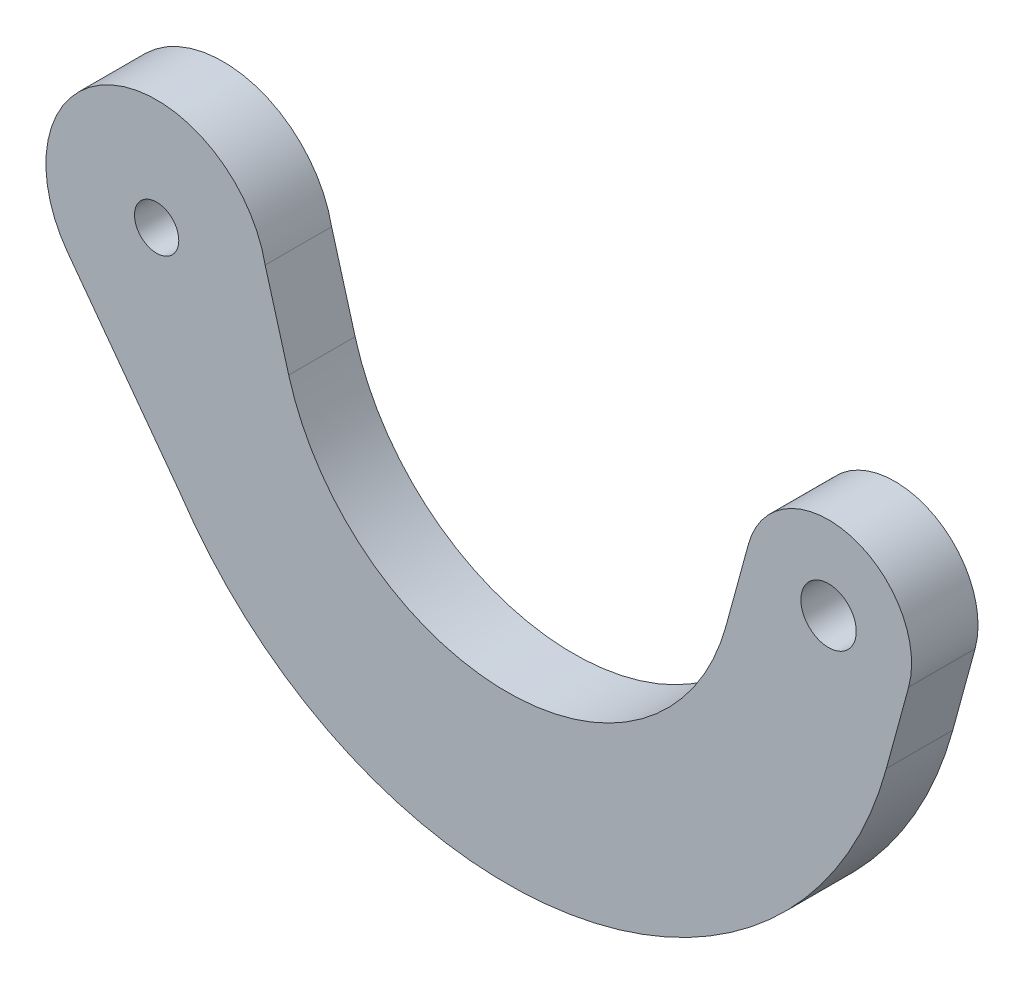
ISO-10303-21;
HEADER;
FILE_DESCRIPTION(('STEP AP214'),'2;1');
FILE_NAME('part.step','',(''),(''),'','','');
FILE_SCHEMA(('AUTOMOTIVE_DESIGN { 1 0 10303 214 1 1 1 1 }'));
ENDSEC;
DATA;
#1=APPLICATION_CONTEXT('core data for automotive mechanical design processes');
#2=APPLICATION_PROTOCOL_DEFINITION('international standard','automotive_design',2000,#1);
#3=PRODUCT_CONTEXT('',#1,'mechanical');
#4=PRODUCT('Part','Part','',(#3));
#5=PRODUCT_RELATED_PRODUCT_CATEGORY('part','',(#4));
#6=PRODUCT_DEFINITION_FORMATION('','',#4);
#7=PRODUCT_DEFINITION_CONTEXT('part definition',#1,'design');
#8=PRODUCT_DEFINITION('design','',#6,#7);
#9=PRODUCT_DEFINITION_SHAPE('','',#8);
#10=(LENGTH_UNIT() NAMED_UNIT(*) SI_UNIT(.MILLI.,.METRE.));
#11=(NAMED_UNIT(*) PLANE_ANGLE_UNIT() SI_UNIT($,.RADIAN.));
#12=(NAMED_UNIT(*) SI_UNIT($,.STERADIAN.) SOLID_ANGLE_UNIT());
#13=UNCERTAINTY_MEASURE_WITH_UNIT(LENGTH_MEASURE(1.E-05),#10,'distance_accuracy_value','');
#14=(GEOMETRIC_REPRESENTATION_CONTEXT(3) GLOBAL_UNCERTAINTY_ASSIGNED_CONTEXT((#13)) GLOBAL_UNIT_ASSIGNED_CONTEXT((#10,
#11,#12)) REPRESENTATION_CONTEXT('',''));
#15=CARTESIAN_POINT('',(0.,0.,0.));
#16=DIRECTION('',(0.,0.,1.));
#17=DIRECTION('',(1.,0.,0.));
#18=AXIS2_PLACEMENT_3D('',#15,#16,#17);
#19=CARTESIAN_POINT('',(60.683,0.,6.));
#20=DIRECTION('',(0.,0.,1.));
#21=DIRECTION('',(1.,0.,0.));
#22=AXIS2_PLACEMENT_3D('',#19,#20,#21);
#23=PLANE('',#22);
#24=CARTESIAN_POINT('',(0.,0.,6.));
#25=DIRECTION('',(0.,0.,1.));
#26=DIRECTION('',(1.,0.,0.));
#27=AXIS2_PLACEMENT_3D('',#24,#25,#26);
#28=CIRCLE('',#27,2.);
#29=CARTESIAN_POINT('',(2.,0.,6.));
#30=VERTEX_POINT('',#29);
#31=EDGE_CURVE('E134',#30,#30,#28,.T.);
#32=ORIENTED_EDGE('',*,*,#31,.F.);
#33=EDGE_LOOP('',(#32));
#34=FACE_BOUND('',#33,.T.);
#35=CARTESIAN_POINT('',(60.683,0.,6.));
#36=DIRECTION('',(0.,0.,1.));
#37=DIRECTION('',(1.,0.,0.));
#38=AXIS2_PLACEMENT_3D('',#35,#36,#37);
#39=CIRCLE('',#38,7.50000000000001);
#40=CARTESIAN_POINT('',(67.9183156248185,-1.97489437926602,6.));
#41=VERTEX_POINT('',#40);
#42=CARTESIAN_POINT('',(53.4476843751814,1.97489437926603,6.));
#43=VERTEX_POINT('',#42);
#44=EDGE_CURVE('E145',#41,#43,#39,.T.);
#45=ORIENTED_EDGE('',*,*,#44,.T.);
#46=DIRECTION('',(-0.263319250568803,-0.964708749975807,0.));
#47=VECTOR('',#46,1.);
#48=CARTESIAN_POINT('',(53.4476843751814,1.97489437926603,6.));
#49=LINE('',#48,#47);
#50=CARTESIAN_POINT('',(51.435225406387,-5.39804463666048,6.));
#51=VERTEX_POINT('',#50);
#52=EDGE_CURVE('E93',#43,#51,#49,.T.);
#53=ORIENTED_EDGE('',*,*,#52,.T.);
#54=CARTESIAN_POINT('',(31.658696031883,0.,6.));
#55=DIRECTION('',(0.,0.,-1.));
#56=DIRECTION('',(1.,0.,0.));
#57=AXIS2_PLACEMENT_3D('',#54,#55,#56);
#58=CIRCLE('',#57,20.5);
#59=CARTESIAN_POINT('',(11.9276637306332,-5.56204677497749,6.));
#60=VERTEX_POINT('',#59);
#61=EDGE_CURVE('E160',#51,#60,#58,.T.);
#62=ORIENTED_EDGE('',*,*,#61,.T.);
#63=DIRECTION('',(-0.271319354876951,0.96248938054877,0.));
#64=VECTOR('',#63,1.);
#65=CARTESIAN_POINT('',(9.80305014731351,1.97489437926603,6.));
#66=LINE('',#65,#64);
#67=CARTESIAN_POINT('',(9.80305014731351,1.97489437926603,6.));
#68=VERTEX_POINT('',#67);
#69=EDGE_CURVE('E173',#60,#68,#66,.T.);
#70=ORIENTED_EDGE('',*,*,#69,.T.);
#71=CARTESIAN_POINT('',(0.,0.,6.));
#72=DIRECTION('',(0.,0.,1.));
#73=DIRECTION('',(1.,0.,0.));
#74=AXIS2_PLACEMENT_3D('',#71,#72,#73);
#75=CIRCLE('',#74,10.);
#76=CARTESIAN_POINT('',(-8.04113037462213,-5.9447642760945,6.));
#77=VERTEX_POINT('',#76);
#78=EDGE_CURVE('E112',#68,#77,#75,.T.);
#79=ORIENTED_EDGE('',*,*,#78,.T.);
#80=DIRECTION('',(0.594476427609448,-0.804113037462214,0.));
#81=VECTOR('',#80,1.);
#82=CARTESIAN_POINT('',(-8.04113037462213,-5.9447642760945,6.));
#83=LINE('',#82,#81);
#84=CARTESIAN_POINT('',(2.11077506429604,-19.6766452042323,6.));
#85=VERTEX_POINT('',#84);
#86=EDGE_CURVE('E106',#77,#85,#83,.T.);
#87=ORIENTED_EDGE('',*,*,#86,.T.);
#88=CARTESIAN_POINT('',(31.658696031883,0.,6.));
#89=DIRECTION('',(0.,0.,1.));
#90=DIRECTION('',(1.,0.,0.));
#91=AXIS2_PLACEMENT_3D('',#88,#89,#90);
#92=CIRCLE('',#91,35.5);
#93=CARTESIAN_POINT('',(65.9058566560241,-9.3478333951925,6.));
#94=VERTEX_POINT('',#93);
#95=EDGE_CURVE('E110',#85,#94,#92,.T.);
#96=ORIENTED_EDGE('',*,*,#95,.T.);
#97=DIRECTION('',(0.263319250568805,0.964708749975806,0.));
#98=VECTOR('',#97,1.);
#99=CARTESIAN_POINT('',(67.9183156248185,-1.97489437926602,6.));
#100=LINE('',#99,#98);
#101=EDGE_CURVE('E50',#94,#41,#100,.T.);
#102=ORIENTED_EDGE('',*,*,#101,.T.);
#103=EDGE_LOOP('',(#45,#53,#62,#70,#79,#87,#96,#102));
#104=FACE_BOUND('',#103,.T.);
#105=CARTESIAN_POINT('',(60.683,0.,6.));
#106=DIRECTION('',(0.,0.,1.));
#107=DIRECTION('',(1.,0.,0.));
#108=AXIS2_PLACEMENT_3D('',#105,#106,#107);
#109=CIRCLE('',#108,2.50000000000001);
#110=CARTESIAN_POINT('',(63.183,0.,6.));
#111=VERTEX_POINT('',#110);
#112=EDGE_CURVE('E182',#111,#111,#109,.T.);
#113=ORIENTED_EDGE('',*,*,#112,.F.);
#114=EDGE_LOOP('',(#113));
#115=FACE_BOUND('',#114,.T.);
#116=ADVANCED_FACE('F33',(#34,#104,#115),#23,.T.);
#117=CARTESIAN_POINT('',(60.683,0.,0.));
#118=DIRECTION('',(0.,0.,1.));
#119=DIRECTION('',(1.,0.,0.));
#120=AXIS2_PLACEMENT_3D('',#117,#118,#119);
#121=PLANE('',#120);
#122=CARTESIAN_POINT('',(0.,0.,0.));
#123=DIRECTION('',(0.,0.,1.));
#124=DIRECTION('',(1.,0.,0.));
#125=AXIS2_PLACEMENT_3D('',#122,#123,#124);
#126=CIRCLE('',#125,2.);
#127=CARTESIAN_POINT('',(2.,0.,0.));
#128=VERTEX_POINT('',#127);
#129=EDGE_CURVE('E179',#128,#128,#126,.T.);
#130=ORIENTED_EDGE('',*,*,#129,.T.);
#131=EDGE_LOOP('',(#130));
#132=FACE_BOUND('',#131,.T.);
#133=CARTESIAN_POINT('',(60.683,0.,0.));
#134=DIRECTION('',(0.,0.,1.));
#135=DIRECTION('',(1.,0.,0.));
#136=AXIS2_PLACEMENT_3D('',#133,#134,#135);
#137=CIRCLE('',#136,7.50000000000001);
#138=CARTESIAN_POINT('',(67.9183156248185,-1.97489437926602,0.));
#139=VERTEX_POINT('',#138);
#140=CARTESIAN_POINT('',(53.4476843751814,1.97489437926603,0.));
#141=VERTEX_POINT('',#140);
#142=EDGE_CURVE('E130',#139,#141,#137,.T.);
#143=ORIENTED_EDGE('',*,*,#142,.F.);
#144=DIRECTION('',(0.263319250568805,0.964708749975806,0.));
#145=VECTOR('',#144,1.);
#146=CARTESIAN_POINT('',(67.9183156248185,-1.97489437926602,0.));
#147=LINE('',#146,#145);
#148=CARTESIAN_POINT('',(65.9058566560241,-9.3478333951925,0.));
#149=VERTEX_POINT('',#148);
#150=EDGE_CURVE('E85',#149,#139,#147,.T.);
#151=ORIENTED_EDGE('',*,*,#150,.F.);
#152=CARTESIAN_POINT('',(31.658696031883,0.,0.));
#153=DIRECTION('',(0.,0.,1.));
#154=DIRECTION('',(1.,0.,0.));
#155=AXIS2_PLACEMENT_3D('',#152,#153,#154);
#156=CIRCLE('',#155,35.5);
#157=CARTESIAN_POINT('',(2.11077506429604,-19.6766452042323,0.));
#158=VERTEX_POINT('',#157);
#159=EDGE_CURVE('E79',#158,#149,#156,.T.);
#160=ORIENTED_EDGE('',*,*,#159,.F.);
#161=DIRECTION('',(0.594476427609448,-0.804113037462214,0.));
#162=VECTOR('',#161,1.);
#163=CARTESIAN_POINT('',(-8.04113037462213,-5.9447642760945,0.));
#164=LINE('',#163,#162);
#165=CARTESIAN_POINT('',(-8.04113037462213,-5.9447642760945,0.));
#166=VERTEX_POINT('',#165);
#167=EDGE_CURVE('E120',#166,#158,#164,.T.);
#168=ORIENTED_EDGE('',*,*,#167,.F.);
#169=CARTESIAN_POINT('',(0.,0.,0.));
#170=DIRECTION('',(0.,0.,1.));
#171=DIRECTION('',(1.,0.,0.));
#172=AXIS2_PLACEMENT_3D('',#169,#170,#171);
#173=CIRCLE('',#172,10.);
#174=CARTESIAN_POINT('',(9.80305014731351,1.97489437926603,0.));
#175=VERTEX_POINT('',#174);
#176=EDGE_CURVE('E140',#175,#166,#173,.T.);
#177=ORIENTED_EDGE('',*,*,#176,.F.);
#178=DIRECTION('',(-0.271319354876951,0.96248938054877,0.));
#179=VECTOR('',#178,1.);
#180=CARTESIAN_POINT('',(9.80305014731351,1.97489437926603,0.));
#181=LINE('',#180,#179);
#182=CARTESIAN_POINT('',(11.9276637306332,-5.56204677497749,0.));
#183=VERTEX_POINT('',#182);
#184=EDGE_CURVE('E138',#183,#175,#181,.T.);
#185=ORIENTED_EDGE('',*,*,#184,.F.);
#186=CARTESIAN_POINT('',(31.658696031883,0.,0.));
#187=DIRECTION('',(0.,0.,-1.));
#188=DIRECTION('',(1.,0.,0.));
#189=AXIS2_PLACEMENT_3D('',#186,#187,#188);
#190=CIRCLE('',#189,20.5);
#191=CARTESIAN_POINT('',(51.435225406387,-5.39804463666048,0.));
#192=VERTEX_POINT('',#191);
#193=EDGE_CURVE('E136',#192,#183,#190,.T.);
#194=ORIENTED_EDGE('',*,*,#193,.F.);
#195=DIRECTION('',(-0.263319250568803,-0.964708749975807,0.));
#196=VECTOR('',#195,1.);
#197=CARTESIAN_POINT('',(53.4476843751814,1.97489437926603,0.));
#198=LINE('',#197,#196);
#199=EDGE_CURVE('E133',#141,#192,#198,.T.);
#200=ORIENTED_EDGE('',*,*,#199,.F.);
#201=EDGE_LOOP('',(#143,#151,#160,#168,#177,#185,#194,#200));
#202=FACE_BOUND('',#201,.T.);
#203=CARTESIAN_POINT('',(60.683,0.,0.));
#204=DIRECTION('',(0.,0.,1.));
#205=DIRECTION('',(1.,0.,0.));
#206=AXIS2_PLACEMENT_3D('',#203,#204,#205);
#207=CIRCLE('',#206,2.50000000000001);
#208=CARTESIAN_POINT('',(63.183,0.,0.));
#209=VERTEX_POINT('',#208);
#210=EDGE_CURVE('E185',#209,#209,#207,.T.);
#211=ORIENTED_EDGE('',*,*,#210,.T.);
#212=EDGE_LOOP('',(#211));
#213=FACE_BOUND('',#212,.T.);
#214=ADVANCED_FACE('F164',(#132,#202,#213),#121,.F.);
#215=CARTESIAN_POINT('',(60.683,0.,6.));
#216=DIRECTION('',(0.,0.,-1.));
#217=DIRECTION('',(-1.,0.,0.));
#218=AXIS2_PLACEMENT_3D('',#215,#216,#217);
#219=CYLINDRICAL_SURFACE('',#218,7.50000000000001);
#220=ORIENTED_EDGE('',*,*,#142,.T.);
#221=DIRECTION('',(0.,0.,-1.));
#222=VECTOR('',#221,1.);
#223=CARTESIAN_POINT('',(53.4476843751814,1.97489437926603,6.));
#224=LINE('',#223,#222);
#225=EDGE_CURVE('E11',#43,#141,#224,.T.);
#226=ORIENTED_EDGE('',*,*,#225,.F.);
#227=ORIENTED_EDGE('',*,*,#44,.F.);
#228=DIRECTION('',(0.,0.,-1.));
#229=VECTOR('',#228,1.);
#230=CARTESIAN_POINT('',(67.9183156248185,-1.97489437926602,6.));
#231=LINE('',#230,#229);
#232=EDGE_CURVE('E126',#41,#139,#231,.T.);
#233=ORIENTED_EDGE('',*,*,#232,.T.);
#234=EDGE_LOOP('',(#220,#226,#227,#233));
#235=FACE_BOUND('',#234,.T.);
#236=ADVANCED_FACE('F35',(#235),#219,.T.);
#237=CARTESIAN_POINT('',(53.4476843751814,1.97489437926603,6.));
#238=DIRECTION('',(0.964708749975807,-0.263319250568803,0.));
#239=DIRECTION('',(0.263319250568803,0.964708749975807,0.));
#240=AXIS2_PLACEMENT_3D('',#237,#238,#239);
#241=PLANE('',#240);
#242=ORIENTED_EDGE('',*,*,#199,.T.);
#243=DIRECTION('',(0.,0.,-1.));
#244=VECTOR('',#243,1.);
#245=CARTESIAN_POINT('',(51.435225406387,-5.39804463666048,6.));
#246=LINE('',#245,#244);
#247=EDGE_CURVE('E42',#51,#192,#246,.T.);
#248=ORIENTED_EDGE('',*,*,#247,.F.);
#249=ORIENTED_EDGE('',*,*,#52,.F.);
#250=ORIENTED_EDGE('',*,*,#225,.T.);
#251=EDGE_LOOP('',(#242,#248,#249,#250));
#252=FACE_BOUND('',#251,.T.);
#253=ADVANCED_FACE('F218',(#252),#241,.F.);
#254=CARTESIAN_POINT('',(31.658696031883,0.,6.));
#255=DIRECTION('',(0.,0.,-1.));
#256=DIRECTION('',(-1.,0.,0.));
#257=AXIS2_PLACEMENT_3D('',#254,#255,#256);
#258=CYLINDRICAL_SURFACE('',#257,20.5);
#259=ORIENTED_EDGE('',*,*,#193,.T.);
#260=DIRECTION('',(0.,0.,-1.));
#261=VECTOR('',#260,1.);
#262=CARTESIAN_POINT('',(11.9276637306332,-5.56204677497749,6.));
#263=LINE('',#262,#261);
#264=EDGE_CURVE('E152',#60,#183,#263,.T.);
#265=ORIENTED_EDGE('',*,*,#264,.F.);
#266=ORIENTED_EDGE('',*,*,#61,.F.);
#267=ORIENTED_EDGE('',*,*,#247,.T.);
#268=EDGE_LOOP('',(#259,#265,#266,#267));
#269=FACE_BOUND('',#268,.T.);
#270=ADVANCED_FACE('F158',(#269),#258,.F.);
#271=CARTESIAN_POINT('',(9.80305014731351,1.97489437926603,6.));
#272=DIRECTION('',(-0.96248938054877,-0.271319354876951,0.));
#273=DIRECTION('',(0.271319354876951,-0.96248938054877,0.));
#274=AXIS2_PLACEMENT_3D('',#271,#272,#273);
#275=PLANE('',#274);
#276=ORIENTED_EDGE('',*,*,#184,.T.);
#277=DIRECTION('',(0.,0.,-1.));
#278=VECTOR('',#277,1.);
#279=CARTESIAN_POINT('',(9.80305014731351,1.97489437926603,6.));
#280=LINE('',#279,#278);
#281=EDGE_CURVE('E149',#68,#175,#280,.T.);
#282=ORIENTED_EDGE('',*,*,#281,.F.);
#283=ORIENTED_EDGE('',*,*,#69,.F.);
#284=ORIENTED_EDGE('',*,*,#264,.T.);
#285=EDGE_LOOP('',(#276,#282,#283,#284));
#286=FACE_BOUND('',#285,.T.);
#287=ADVANCED_FACE('F169',(#286),#275,.F.);
#288=CARTESIAN_POINT('',(0.,0.,6.));
#289=DIRECTION('',(0.,0.,-1.));
#290=DIRECTION('',(-1.,0.,0.));
#291=AXIS2_PLACEMENT_3D('',#288,#289,#290);
#292=CYLINDRICAL_SURFACE('',#291,10.);
#293=ORIENTED_EDGE('',*,*,#176,.T.);
#294=DIRECTION('',(0.,0.,-1.));
#295=VECTOR('',#294,1.);
#296=CARTESIAN_POINT('',(-8.04113037462213,-5.9447642760945,6.));
#297=LINE('',#296,#295);
#298=EDGE_CURVE('E121',#77,#166,#297,.T.);
#299=ORIENTED_EDGE('',*,*,#298,.F.);
#300=ORIENTED_EDGE('',*,*,#78,.F.);
#301=ORIENTED_EDGE('',*,*,#281,.T.);
#302=EDGE_LOOP('',(#293,#299,#300,#301));
#303=FACE_BOUND('',#302,.T.);
#304=ADVANCED_FACE('F172',(#303),#292,.T.);
#305=CARTESIAN_POINT('',(-8.04113037462213,-5.9447642760945,6.));
#306=DIRECTION('',(0.804113037462214,0.594476427609448,0.));
#307=DIRECTION('',(-0.594476427609449,0.804113037462214,0.));
#308=AXIS2_PLACEMENT_3D('',#305,#306,#307);
#309=PLANE('',#308);
#310=ORIENTED_EDGE('',*,*,#167,.T.);
#311=DIRECTION('',(0.,0.,-1.));
#312=VECTOR('',#311,1.);
#313=CARTESIAN_POINT('',(2.11077506429604,-19.6766452042323,6.));
#314=LINE('',#313,#312);
#315=EDGE_CURVE('E117',#85,#158,#314,.T.);
#316=ORIENTED_EDGE('',*,*,#315,.F.);
#317=ORIENTED_EDGE('',*,*,#86,.F.);
#318=ORIENTED_EDGE('',*,*,#298,.T.);
#319=EDGE_LOOP('',(#310,#316,#317,#318));
#320=FACE_BOUND('',#319,.T.);
#321=ADVANCED_FACE('F118',(#320),#309,.F.);
#322=CARTESIAN_POINT('',(31.658696031883,0.,6.));
#323=DIRECTION('',(0.,0.,-1.));
#324=DIRECTION('',(-1.,0.,0.));
#325=AXIS2_PLACEMENT_3D('',#322,#323,#324);
#326=CYLINDRICAL_SURFACE('',#325,35.5);
#327=ORIENTED_EDGE('',*,*,#159,.T.);
#328=DIRECTION('',(0.,0.,-1.));
#329=VECTOR('',#328,1.);
#330=CARTESIAN_POINT('',(65.9058566560241,-9.3478333951925,6.));
#331=LINE('',#330,#329);
#332=EDGE_CURVE('E122',#94,#149,#331,.T.);
#333=ORIENTED_EDGE('',*,*,#332,.F.);
#334=ORIENTED_EDGE('',*,*,#95,.F.);
#335=ORIENTED_EDGE('',*,*,#315,.T.);
#336=EDGE_LOOP('',(#327,#333,#334,#335));
#337=FACE_BOUND('',#336,.T.);
#338=ADVANCED_FACE('F124',(#337),#326,.T.);
#339=CARTESIAN_POINT('',(67.9183156248185,-1.97489437926602,6.));
#340=DIRECTION('',(-0.964708749975806,0.263319250568805,0.));
#341=DIRECTION('',(-0.263319250568805,-0.964708749975806,0.));
#342=AXIS2_PLACEMENT_3D('',#339,#340,#341);
#343=PLANE('',#342);
#344=ORIENTED_EDGE('',*,*,#150,.T.);
#345=ORIENTED_EDGE('',*,*,#232,.F.);
#346=ORIENTED_EDGE('',*,*,#101,.F.);
#347=ORIENTED_EDGE('',*,*,#332,.T.);
#348=EDGE_LOOP('',(#344,#345,#346,#347));
#349=FACE_BOUND('',#348,.T.);
#350=ADVANCED_FACE('F206',(#349),#343,.F.);
#351=CARTESIAN_POINT('',(0.,0.,6.));
#352=DIRECTION('',(0.,0.,-1.));
#353=DIRECTION('',(-1.,0.,0.));
#354=AXIS2_PLACEMENT_3D('',#351,#352,#353);
#355=CYLINDRICAL_SURFACE('',#354,2.);
#356=ORIENTED_EDGE('',*,*,#31,.T.);
#357=EDGE_LOOP('',(#356));
#358=FACE_BOUND('',#357,.T.);
#359=ORIENTED_EDGE('',*,*,#129,.F.);
#360=EDGE_LOOP('',(#359));
#361=FACE_BOUND('',#360,.T.);
#362=ADVANCED_FACE('F203',(#358,#361),#355,.F.);
#363=CARTESIAN_POINT('',(60.683,0.,6.));
#364=DIRECTION('',(0.,0.,-1.));
#365=DIRECTION('',(-1.,0.,0.));
#366=AXIS2_PLACEMENT_3D('',#363,#364,#365);
#367=CYLINDRICAL_SURFACE('',#366,2.50000000000001);
#368=ORIENTED_EDGE('',*,*,#112,.T.);
#369=EDGE_LOOP('',(#368));
#370=FACE_BOUND('',#369,.T.);
#371=ORIENTED_EDGE('',*,*,#210,.F.);
#372=EDGE_LOOP('',(#371));
#373=FACE_BOUND('',#372,.T.);
#374=ADVANCED_FACE('F191',(#370,#373),#367,.F.);
#375=CLOSED_SHELL('',(#116,#214,#236,#253,#270,#287,#304,#321,#338,#350,#362,#374));
#376=MANIFOLD_SOLID_BREP('B2',#375);
#377=ADVANCED_BREP_SHAPE_REPRESENTATION('',(#18,#376),#14);
#378=SHAPE_DEFINITION_REPRESENTATION(#9,#377);
ENDSEC;
END-ISO-10303-21;
